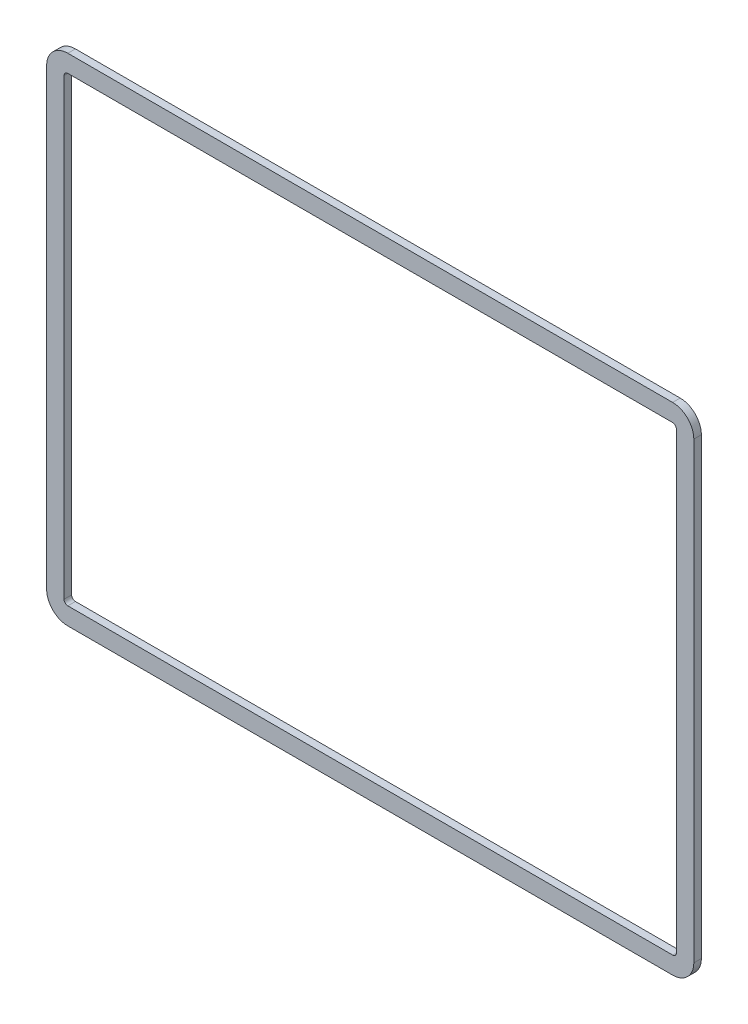
ISO-10303-21;
HEADER;
FILE_DESCRIPTION(('STEP AP214'),'2;1');
FILE_NAME('part.step','',(''),(''),'','','');
FILE_SCHEMA(('AUTOMOTIVE_DESIGN { 1 0 10303 214 1 1 1 1 }'));
ENDSEC;
DATA;
#1=APPLICATION_CONTEXT('core data for automotive mechanical design processes');
#2=APPLICATION_PROTOCOL_DEFINITION('international standard','automotive_design',2000,#1);
#3=PRODUCT_CONTEXT('',#1,'mechanical');
#4=PRODUCT('Part','Part','',(#3));
#5=PRODUCT_RELATED_PRODUCT_CATEGORY('part','',(#4));
#6=PRODUCT_DEFINITION_FORMATION('','',#4);
#7=PRODUCT_DEFINITION_CONTEXT('part definition',#1,'design');
#8=PRODUCT_DEFINITION('design','',#6,#7);
#9=PRODUCT_DEFINITION_SHAPE('','',#8);
#10=(LENGTH_UNIT() NAMED_UNIT(*) SI_UNIT(.MILLI.,.METRE.));
#11=(NAMED_UNIT(*) PLANE_ANGLE_UNIT() SI_UNIT($,.RADIAN.));
#12=(NAMED_UNIT(*) SI_UNIT($,.STERADIAN.) SOLID_ANGLE_UNIT());
#13=UNCERTAINTY_MEASURE_WITH_UNIT(LENGTH_MEASURE(1.E-05),#10,'distance_accuracy_value','');
#14=(GEOMETRIC_REPRESENTATION_CONTEXT(3) GLOBAL_UNCERTAINTY_ASSIGNED_CONTEXT((#13)) GLOBAL_UNIT_ASSIGNED_CONTEXT((#10,
#11,#12)) REPRESENTATION_CONTEXT('',''));
#15=CARTESIAN_POINT('',(0.,0.,0.));
#16=DIRECTION('',(0.,0.,1.));
#17=DIRECTION('',(1.,0.,0.));
#18=AXIS2_PLACEMENT_3D('',#15,#16,#17);
#19=CARTESIAN_POINT('',(0.,0.,0.));
#20=DIRECTION('',(0.,0.,-1.));
#21=DIRECTION('',(-1.,0.,0.));
#22=AXIS2_PLACEMENT_3D('',#19,#20,#21);
#23=PLANE('',#22);
#24=DIRECTION('',(-1.,0.,0.));
#25=VECTOR('',#24,1.);
#26=CARTESIAN_POINT('',(842.873702112464,-1312.94252894504,0.));
#27=LINE('',#26,#25);
#28=CARTESIAN_POINT('',(842.873702112464,-1312.94252894504,0.));
#29=VERTEX_POINT('',#28);
#30=CARTESIAN_POINT('',(639.673702112464,-1312.94252894504,0.));
#31=VERTEX_POINT('',#30);
#32=EDGE_CURVE('E227',#29,#31,#27,.T.);
#33=ORIENTED_EDGE('',*,*,#32,.T.);
#34=CARTESIAN_POINT('',(639.673702112464,-1320.06252894504,0.));
#35=DIRECTION('',(0.,0.,1.));
#36=DIRECTION('',(1.,0.,0.));
#37=AXIS2_PLACEMENT_3D('',#34,#35,#36);
#38=CIRCLE('',#37,7.12000000000007);
#39=CARTESIAN_POINT('',(632.553702112464,-1320.06252894504,0.));
#40=VERTEX_POINT('',#39);
#41=EDGE_CURVE('E11',#31,#40,#38,.T.);
#42=ORIENTED_EDGE('',*,*,#41,.T.);
#43=DIRECTION('',(0.,-1.,0.));
#44=VECTOR('',#43,1.);
#45=CARTESIAN_POINT('',(632.553702112464,-1320.06252894504,0.));
#46=LINE('',#45,#44);
#47=CARTESIAN_POINT('',(632.553702112464,-1472.46252894504,0.));
#48=VERTEX_POINT('',#47);
#49=EDGE_CURVE('E47',#40,#48,#46,.T.);
#50=ORIENTED_EDGE('',*,*,#49,.T.);
#51=CARTESIAN_POINT('',(639.673702112464,-1472.46252894504,0.));
#52=DIRECTION('',(0.,0.,1.));
#53=DIRECTION('',(1.,0.,0.));
#54=AXIS2_PLACEMENT_3D('',#51,#52,#53);
#55=CIRCLE('',#54,7.12000000000007);
#56=CARTESIAN_POINT('',(639.673702112464,-1479.58252894504,0.));
#57=VERTEX_POINT('',#56);
#58=EDGE_CURVE('E213',#48,#57,#55,.T.);
#59=ORIENTED_EDGE('',*,*,#58,.T.);
#60=DIRECTION('',(1.,0.,0.));
#61=VECTOR('',#60,1.);
#62=CARTESIAN_POINT('',(639.673702112464,-1479.58252894504,0.));
#63=LINE('',#62,#61);
#64=CARTESIAN_POINT('',(842.873702112464,-1479.58252894504,0.));
#65=VERTEX_POINT('',#64);
#66=EDGE_CURVE('E216',#57,#65,#63,.T.);
#67=ORIENTED_EDGE('',*,*,#66,.T.);
#68=CARTESIAN_POINT('',(842.873702112464,-1472.46252894504,0.));
#69=DIRECTION('',(0.,0.,1.));
#70=DIRECTION('',(1.,0.,0.));
#71=AXIS2_PLACEMENT_3D('',#68,#69,#70);
#72=CIRCLE('',#71,7.12000000000002);
#73=CARTESIAN_POINT('',(849.993702112464,-1472.46252894504,0.));
#74=VERTEX_POINT('',#73);
#75=EDGE_CURVE('E219',#65,#74,#72,.T.);
#76=ORIENTED_EDGE('',*,*,#75,.T.);
#77=DIRECTION('',(0.,1.,0.));
#78=VECTOR('',#77,1.);
#79=CARTESIAN_POINT('',(849.993702112464,-1472.46252894504,0.));
#80=LINE('',#79,#78);
#81=CARTESIAN_POINT('',(849.993702112464,-1320.06252894504,0.));
#82=VERTEX_POINT('',#81);
#83=EDGE_CURVE('E222',#74,#82,#80,.T.);
#84=ORIENTED_EDGE('',*,*,#83,.T.);
#85=CARTESIAN_POINT('',(842.873702112464,-1320.06252894504,0.));
#86=DIRECTION('',(0.,0.,1.));
#87=DIRECTION('',(1.,0.,0.));
#88=AXIS2_PLACEMENT_3D('',#85,#86,#87);
#89=CIRCLE('',#88,7.12000000000007);
#90=EDGE_CURVE('E225',#82,#29,#89,.T.);
#91=ORIENTED_EDGE('',*,*,#90,.T.);
#92=EDGE_LOOP('',(#33,#42,#50,#59,#67,#76,#84,#91));
#93=FACE_BOUND('',#92,.T.);
#94=CARTESIAN_POINT('',(842.873702112464,-1320.06252894504,0.));
#95=DIRECTION('',(0.,0.,-1.));
#96=DIRECTION('',(-1.,0.,0.));
#97=AXIS2_PLACEMENT_3D('',#94,#95,#96);
#98=CIRCLE('',#97,1.27000000000005);
#99=CARTESIAN_POINT('',(844.143702112464,-1320.06252894504,0.));
#100=VERTEX_POINT('',#99);
#101=CARTESIAN_POINT('',(842.873702112464,-1318.79252894504,0.));
#102=VERTEX_POINT('',#101);
#103=EDGE_CURVE('E42',#100,#102,#98,.F.);
#104=ORIENTED_EDGE('',*,*,#103,.F.);
#105=DIRECTION('',(0.,1.,0.));
#106=VECTOR('',#105,1.);
#107=CARTESIAN_POINT('',(844.143702112464,-1472.46252894504,0.));
#108=LINE('',#107,#106);
#109=CARTESIAN_POINT('',(844.143702112464,-1472.46252894504,0.));
#110=VERTEX_POINT('',#109);
#111=EDGE_CURVE('E170',#110,#100,#108,.T.);
#112=ORIENTED_EDGE('',*,*,#111,.F.);
#113=CARTESIAN_POINT('',(842.873702112464,-1472.46252894504,0.));
#114=DIRECTION('',(0.,0.,-1.));
#115=DIRECTION('',(-1.,0.,0.));
#116=AXIS2_PLACEMENT_3D('',#113,#114,#115);
#117=CIRCLE('',#116,1.26999999999999);
#118=CARTESIAN_POINT('',(842.873702112464,-1473.73252894504,0.));
#119=VERTEX_POINT('',#118);
#120=EDGE_CURVE('E229',#119,#110,#117,.F.);
#121=ORIENTED_EDGE('',*,*,#120,.F.);
#122=DIRECTION('',(1.,0.,0.));
#123=VECTOR('',#122,1.);
#124=CARTESIAN_POINT('',(639.673702112464,-1473.73252894504,0.));
#125=LINE('',#124,#123);
#126=CARTESIAN_POINT('',(639.673702112464,-1473.73252894504,0.));
#127=VERTEX_POINT('',#126);
#128=EDGE_CURVE('E262',#127,#119,#125,.T.);
#129=ORIENTED_EDGE('',*,*,#128,.F.);
#130=CARTESIAN_POINT('',(639.673702112464,-1472.46252894504,0.));
#131=DIRECTION('',(0.,0.,-1.));
#132=DIRECTION('',(-1.,0.,0.));
#133=AXIS2_PLACEMENT_3D('',#130,#131,#132);
#134=CIRCLE('',#133,1.27000000000005);
#135=CARTESIAN_POINT('',(638.403702112464,-1472.46252894504,0.));
#136=VERTEX_POINT('',#135);
#137=EDGE_CURVE('E251',#136,#127,#134,.F.);
#138=ORIENTED_EDGE('',*,*,#137,.F.);
#139=DIRECTION('',(0.,-1.,0.));
#140=VECTOR('',#139,1.);
#141=CARTESIAN_POINT('',(638.403702112464,-1320.06252894504,0.));
#142=LINE('',#141,#140);
#143=CARTESIAN_POINT('',(638.403702112464,-1320.06252894504,0.));
#144=VERTEX_POINT('',#143);
#145=EDGE_CURVE('E169',#144,#136,#142,.T.);
#146=ORIENTED_EDGE('',*,*,#145,.F.);
#147=CARTESIAN_POINT('',(639.673702112464,-1320.06252894504,0.));
#148=DIRECTION('',(0.,0.,-1.));
#149=DIRECTION('',(-1.,0.,0.));
#150=AXIS2_PLACEMENT_3D('',#147,#148,#149);
#151=CIRCLE('',#150,1.26999999999988);
#152=CARTESIAN_POINT('',(639.673702112464,-1318.79252894504,0.));
#153=VERTEX_POINT('',#152);
#154=EDGE_CURVE('E161',#153,#144,#151,.F.);
#155=ORIENTED_EDGE('',*,*,#154,.F.);
#156=DIRECTION('',(-1.,0.,0.));
#157=VECTOR('',#156,1.);
#158=CARTESIAN_POINT('',(842.873702112464,-1318.79252894504,0.));
#159=LINE('',#158,#157);
#160=EDGE_CURVE('E164',#102,#153,#159,.T.);
#161=ORIENTED_EDGE('',*,*,#160,.F.);
#162=EDGE_LOOP('',(#104,#112,#121,#129,#138,#146,#155,#161));
#163=FACE_BOUND('',#162,.T.);
#164=ADVANCED_FACE('F39',(#93,#163),#23,.F.);
#165=CARTESIAN_POINT('',(639.673702112464,-1320.06252894504,-2.54));
#166=DIRECTION('',(0.,0.,1.));
#167=DIRECTION('',(1.,0.,0.));
#168=AXIS2_PLACEMENT_3D('',#165,#166,#167);
#169=CYLINDRICAL_SURFACE('',#168,7.12000000000007);
#170=ORIENTED_EDGE('',*,*,#41,.F.);
#171=DIRECTION('',(0.,0.,1.));
#172=VECTOR('',#171,1.);
#173=CARTESIAN_POINT('',(639.673702112464,-1312.94252894504,-2.54));
#174=LINE('',#173,#172);
#175=CARTESIAN_POINT('',(639.673702112464,-1312.94252894504,-2.54));
#176=VERTEX_POINT('',#175);
#177=EDGE_CURVE('E162',#176,#31,#174,.T.);
#178=ORIENTED_EDGE('',*,*,#177,.F.);
#179=CARTESIAN_POINT('',(639.673702112464,-1320.06252894504,-2.54));
#180=DIRECTION('',(0.,0.,1.));
#181=DIRECTION('',(1.,0.,0.));
#182=AXIS2_PLACEMENT_3D('',#179,#180,#181);
#183=CIRCLE('',#182,7.12000000000007);
#184=CARTESIAN_POINT('',(632.553702112464,-1320.06252894504,-2.54));
#185=VERTEX_POINT('',#184);
#186=EDGE_CURVE('E186',#176,#185,#183,.T.);
#187=ORIENTED_EDGE('',*,*,#186,.T.);
#188=DIRECTION('',(0.,0.,1.));
#189=VECTOR('',#188,1.);
#190=CARTESIAN_POINT('',(632.553702112464,-1320.06252894504,-2.54));
#191=LINE('',#190,#189);
#192=EDGE_CURVE('E210',#185,#40,#191,.T.);
#193=ORIENTED_EDGE('',*,*,#192,.T.);
#194=EDGE_LOOP('',(#170,#178,#187,#193));
#195=FACE_BOUND('',#194,.T.);
#196=ADVANCED_FACE('F318',(#195),#169,.T.);
#197=CARTESIAN_POINT('',(632.553702112464,-1320.06252894504,-2.54));
#198=DIRECTION('',(-1.,0.,0.));
#199=DIRECTION('',(0.,0.,1.));
#200=AXIS2_PLACEMENT_3D('',#197,#198,#199);
#201=PLANE('',#200);
#202=ORIENTED_EDGE('',*,*,#49,.F.);
#203=ORIENTED_EDGE('',*,*,#192,.F.);
#204=DIRECTION('',(0.,-1.,0.));
#205=VECTOR('',#204,1.);
#206=CARTESIAN_POINT('',(632.553702112464,-1320.06252894504,-2.54));
#207=LINE('',#206,#205);
#208=CARTESIAN_POINT('',(632.553702112464,-1472.46252894504,-2.54));
#209=VERTEX_POINT('',#208);
#210=EDGE_CURVE('E189',#185,#209,#207,.T.);
#211=ORIENTED_EDGE('',*,*,#210,.T.);
#212=DIRECTION('',(0.,0.,1.));
#213=VECTOR('',#212,1.);
#214=CARTESIAN_POINT('',(632.553702112464,-1472.46252894504,-2.54));
#215=LINE('',#214,#213);
#216=EDGE_CURVE('E247',#209,#48,#215,.T.);
#217=ORIENTED_EDGE('',*,*,#216,.T.);
#218=EDGE_LOOP('',(#202,#203,#211,#217));
#219=FACE_BOUND('',#218,.T.);
#220=ADVANCED_FACE('F325',(#219),#201,.T.);
#221=CARTESIAN_POINT('',(639.673702112464,-1472.46252894504,-2.54));
#222=DIRECTION('',(0.,0.,1.));
#223=DIRECTION('',(1.,0.,0.));
#224=AXIS2_PLACEMENT_3D('',#221,#222,#223);
#225=CYLINDRICAL_SURFACE('',#224,7.12000000000007);
#226=ORIENTED_EDGE('',*,*,#58,.F.);
#227=ORIENTED_EDGE('',*,*,#216,.F.);
#228=CARTESIAN_POINT('',(639.673702112464,-1472.46252894504,-2.54));
#229=DIRECTION('',(0.,0.,1.));
#230=DIRECTION('',(1.,0.,0.));
#231=AXIS2_PLACEMENT_3D('',#228,#229,#230);
#232=CIRCLE('',#231,7.12000000000007);
#233=CARTESIAN_POINT('',(639.673702112464,-1479.58252894504,-2.54));
#234=VERTEX_POINT('',#233);
#235=EDGE_CURVE('E193',#209,#234,#232,.T.);
#236=ORIENTED_EDGE('',*,*,#235,.T.);
#237=DIRECTION('',(0.,0.,1.));
#238=VECTOR('',#237,1.);
#239=CARTESIAN_POINT('',(639.673702112464,-1479.58252894504,-2.54));
#240=LINE('',#239,#238);
#241=EDGE_CURVE('E244',#234,#57,#240,.T.);
#242=ORIENTED_EDGE('',*,*,#241,.T.);
#243=EDGE_LOOP('',(#226,#227,#236,#242));
#244=FACE_BOUND('',#243,.T.);
#245=ADVANCED_FACE('F346',(#244),#225,.T.);
#246=CARTESIAN_POINT('',(639.673702112464,-1479.58252894504,-2.54));
#247=DIRECTION('',(0.,-1.,0.));
#248=DIRECTION('',(0.,0.,-1.));
#249=AXIS2_PLACEMENT_3D('',#246,#247,#248);
#250=PLANE('',#249);
#251=ORIENTED_EDGE('',*,*,#66,.F.);
#252=ORIENTED_EDGE('',*,*,#241,.F.);
#253=DIRECTION('',(1.,0.,0.));
#254=VECTOR('',#253,1.);
#255=CARTESIAN_POINT('',(639.673702112464,-1479.58252894504,-2.54));
#256=LINE('',#255,#254);
#257=CARTESIAN_POINT('',(842.873702112464,-1479.58252894504,-2.54));
#258=VERTEX_POINT('',#257);
#259=EDGE_CURVE('E196',#234,#258,#256,.T.);
#260=ORIENTED_EDGE('',*,*,#259,.T.);
#261=DIRECTION('',(0.,0.,1.));
#262=VECTOR('',#261,1.);
#263=CARTESIAN_POINT('',(842.873702112464,-1479.58252894504,-2.54));
#264=LINE('',#263,#262);
#265=EDGE_CURVE('E241',#258,#65,#264,.T.);
#266=ORIENTED_EDGE('',*,*,#265,.T.);
#267=EDGE_LOOP('',(#251,#252,#260,#266));
#268=FACE_BOUND('',#267,.T.);
#269=ADVANCED_FACE('F342',(#268),#250,.T.);
#270=CARTESIAN_POINT('',(842.873702112464,-1472.46252894504,-2.54));
#271=DIRECTION('',(0.,0.,1.));
#272=DIRECTION('',(1.,0.,0.));
#273=AXIS2_PLACEMENT_3D('',#270,#271,#272);
#274=CYLINDRICAL_SURFACE('',#273,7.12000000000002);
#275=ORIENTED_EDGE('',*,*,#75,.F.);
#276=ORIENTED_EDGE('',*,*,#265,.F.);
#277=CARTESIAN_POINT('',(842.873702112464,-1472.46252894504,-2.54));
#278=DIRECTION('',(0.,0.,1.));
#279=DIRECTION('',(1.,0.,0.));
#280=AXIS2_PLACEMENT_3D('',#277,#278,#279);
#281=CIRCLE('',#280,7.12000000000002);
#282=CARTESIAN_POINT('',(849.993702112464,-1472.46252894504,-2.54));
#283=VERTEX_POINT('',#282);
#284=EDGE_CURVE('E199',#258,#283,#281,.T.);
#285=ORIENTED_EDGE('',*,*,#284,.T.);
#286=DIRECTION('',(0.,0.,1.));
#287=VECTOR('',#286,1.);
#288=CARTESIAN_POINT('',(849.993702112464,-1472.46252894504,-2.54));
#289=LINE('',#288,#287);
#290=EDGE_CURVE('E238',#283,#74,#289,.T.);
#291=ORIENTED_EDGE('',*,*,#290,.T.);
#292=EDGE_LOOP('',(#275,#276,#285,#291));
#293=FACE_BOUND('',#292,.T.);
#294=ADVANCED_FACE('F339',(#293),#274,.T.);
#295=CARTESIAN_POINT('',(842.873702112464,-1312.94252894504,-2.54));
#296=DIRECTION('',(0.,1.,0.));
#297=DIRECTION('',(0.,0.,1.));
#298=AXIS2_PLACEMENT_3D('',#295,#296,#297);
#299=PLANE('',#298);
#300=ORIENTED_EDGE('',*,*,#32,.F.);
#301=DIRECTION('',(0.,0.,1.));
#302=VECTOR('',#301,1.);
#303=CARTESIAN_POINT('',(842.873702112464,-1312.94252894504,-2.54));
#304=LINE('',#303,#302);
#305=CARTESIAN_POINT('',(842.873702112464,-1312.94252894504,-2.54));
#306=VERTEX_POINT('',#305);
#307=EDGE_CURVE('E232',#306,#29,#304,.T.);
#308=ORIENTED_EDGE('',*,*,#307,.F.);
#309=DIRECTION('',(-1.,0.,0.));
#310=VECTOR('',#309,1.);
#311=CARTESIAN_POINT('',(842.873702112464,-1312.94252894504,-2.54));
#312=LINE('',#311,#310);
#313=EDGE_CURVE('E208',#306,#176,#312,.T.);
#314=ORIENTED_EDGE('',*,*,#313,.T.);
#315=ORIENTED_EDGE('',*,*,#177,.T.);
#316=EDGE_LOOP('',(#300,#308,#314,#315));
#317=FACE_BOUND('',#316,.T.);
#318=ADVANCED_FACE('F336',(#317),#299,.T.);
#319=CARTESIAN_POINT('',(842.873702112464,-1472.46252894504,-2.54));
#320=DIRECTION('',(0.,0.,1.));
#321=DIRECTION('',(1.,0.,0.));
#322=AXIS2_PLACEMENT_3D('',#319,#320,#321);
#323=CYLINDRICAL_SURFACE('',#322,1.26999999999999);
#324=DIRECTION('',(0.,0.,1.));
#325=VECTOR('',#324,1.);
#326=CARTESIAN_POINT('',(842.873702112464,-1473.73252894504,-2.54));
#327=LINE('',#326,#325);
#328=CARTESIAN_POINT('',(842.873702112464,-1473.73252894504,-2.54));
#329=VERTEX_POINT('',#328);
#330=EDGE_CURVE('E190',#329,#119,#327,.T.);
#331=ORIENTED_EDGE('',*,*,#330,.T.);
#332=ORIENTED_EDGE('',*,*,#120,.T.);
#333=DIRECTION('',(0.,0.,1.));
#334=VECTOR('',#333,1.);
#335=CARTESIAN_POINT('',(844.143702112464,-1472.46252894504,-2.54));
#336=LINE('',#335,#334);
#337=CARTESIAN_POINT('',(844.143702112464,-1472.46252894504,-2.54));
#338=VERTEX_POINT('',#337);
#339=EDGE_CURVE('E179',#338,#110,#336,.T.);
#340=ORIENTED_EDGE('',*,*,#339,.F.);
#341=CARTESIAN_POINT('',(842.873702112464,-1472.46252894504,-2.54));
#342=DIRECTION('',(0.,0.,1.));
#343=DIRECTION('',(1.,0.,0.));
#344=AXIS2_PLACEMENT_3D('',#341,#342,#343);
#345=CIRCLE('',#344,1.26999999999999);
#346=EDGE_CURVE('E275',#329,#338,#345,.T.);
#347=ORIENTED_EDGE('',*,*,#346,.F.);
#348=EDGE_LOOP('',(#331,#332,#340,#347));
#349=FACE_BOUND('',#348,.T.);
#350=ADVANCED_FACE('F299',(#349),#323,.F.);
#351=CARTESIAN_POINT('',(639.673702112464,-1320.06252894504,-2.54));
#352=DIRECTION('',(0.,0.,1.));
#353=DIRECTION('',(1.,0.,0.));
#354=AXIS2_PLACEMENT_3D('',#351,#352,#353);
#355=PLANE('',#354);
#356=DIRECTION('',(1.,0.,0.));
#357=VECTOR('',#356,1.);
#358=CARTESIAN_POINT('',(639.673702112464,-1473.73252894504,-2.54));
#359=LINE('',#358,#357);
#360=CARTESIAN_POINT('',(639.673702112464,-1473.73252894504,-2.54));
#361=VERTEX_POINT('',#360);
#362=EDGE_CURVE('E185',#361,#329,#359,.T.);
#363=ORIENTED_EDGE('',*,*,#362,.T.);
#364=ORIENTED_EDGE('',*,*,#346,.T.);
#365=DIRECTION('',(0.,1.,0.));
#366=VECTOR('',#365,1.);
#367=CARTESIAN_POINT('',(844.143702112464,-1472.46252894504,-2.54));
#368=LINE('',#367,#366);
#369=CARTESIAN_POINT('',(844.143702112464,-1320.06252894504,-2.54));
#370=VERTEX_POINT('',#369);
#371=EDGE_CURVE('E288',#338,#370,#368,.T.);
#372=ORIENTED_EDGE('',*,*,#371,.T.);
#373=CARTESIAN_POINT('',(842.873702112464,-1320.06252894504,-2.54));
#374=DIRECTION('',(0.,0.,1.));
#375=DIRECTION('',(1.,0.,0.));
#376=AXIS2_PLACEMENT_3D('',#373,#374,#375);
#377=CIRCLE('',#376,1.27000000000005);
#378=CARTESIAN_POINT('',(842.873702112464,-1318.79252894504,-2.54));
#379=VERTEX_POINT('',#378);
#380=EDGE_CURVE('E286',#370,#379,#377,.T.);
#381=ORIENTED_EDGE('',*,*,#380,.T.);
#382=DIRECTION('',(-1.,0.,0.));
#383=VECTOR('',#382,1.);
#384=CARTESIAN_POINT('',(842.873702112464,-1318.79252894504,-2.54));
#385=LINE('',#384,#383);
#386=CARTESIAN_POINT('',(639.673702112464,-1318.79252894504,-2.54));
#387=VERTEX_POINT('',#386);
#388=EDGE_CURVE('E173',#379,#387,#385,.T.);
#389=ORIENTED_EDGE('',*,*,#388,.T.);
#390=CARTESIAN_POINT('',(639.673702112464,-1320.06252894504,-2.54));
#391=DIRECTION('',(0.,0.,1.));
#392=DIRECTION('',(1.,0.,0.));
#393=AXIS2_PLACEMENT_3D('',#390,#391,#392);
#394=CIRCLE('',#393,1.26999999999988);
#395=CARTESIAN_POINT('',(638.403702112464,-1320.06252894504,-2.54));
#396=VERTEX_POINT('',#395);
#397=EDGE_CURVE('E283',#387,#396,#394,.T.);
#398=ORIENTED_EDGE('',*,*,#397,.T.);
#399=DIRECTION('',(0.,-1.,0.));
#400=VECTOR('',#399,1.);
#401=CARTESIAN_POINT('',(638.403702112464,-1320.06252894504,-2.54));
#402=LINE('',#401,#400);
#403=CARTESIAN_POINT('',(638.403702112464,-1472.46252894504,-2.54));
#404=VERTEX_POINT('',#403);
#405=EDGE_CURVE('E265',#396,#404,#402,.T.);
#406=ORIENTED_EDGE('',*,*,#405,.T.);
#407=CARTESIAN_POINT('',(639.673702112464,-1472.46252894504,-2.54));
#408=DIRECTION('',(0.,0.,1.));
#409=DIRECTION('',(1.,0.,0.));
#410=AXIS2_PLACEMENT_3D('',#407,#408,#409);
#411=CIRCLE('',#410,1.27000000000005);
#412=EDGE_CURVE('E279',#404,#361,#411,.T.);
#413=ORIENTED_EDGE('',*,*,#412,.T.);
#414=EDGE_LOOP('',(#363,#364,#372,#381,#389,#398,#406,#413));
#415=FACE_BOUND('',#414,.T.);
#416=ORIENTED_EDGE('',*,*,#186,.F.);
#417=ORIENTED_EDGE('',*,*,#313,.F.);
#418=CARTESIAN_POINT('',(842.873702112464,-1320.06252894504,-2.54));
#419=DIRECTION('',(0.,0.,1.));
#420=DIRECTION('',(1.,0.,0.));
#421=AXIS2_PLACEMENT_3D('',#418,#419,#420);
#422=CIRCLE('',#421,7.12000000000007);
#423=CARTESIAN_POINT('',(849.993702112464,-1320.06252894504,-2.54));
#424=VERTEX_POINT('',#423);
#425=EDGE_CURVE('E205',#424,#306,#422,.T.);
#426=ORIENTED_EDGE('',*,*,#425,.F.);
#427=DIRECTION('',(0.,1.,0.));
#428=VECTOR('',#427,1.);
#429=CARTESIAN_POINT('',(849.993702112464,-1472.46252894504,-2.54));
#430=LINE('',#429,#428);
#431=EDGE_CURVE('E202',#283,#424,#430,.T.);
#432=ORIENTED_EDGE('',*,*,#431,.F.);
#433=ORIENTED_EDGE('',*,*,#284,.F.);
#434=ORIENTED_EDGE('',*,*,#259,.F.);
#435=ORIENTED_EDGE('',*,*,#235,.F.);
#436=ORIENTED_EDGE('',*,*,#210,.F.);
#437=EDGE_LOOP('',(#416,#417,#426,#432,#433,#434,#435,#436));
#438=FACE_BOUND('',#437,.T.);
#439=ADVANCED_FACE('F293',(#415,#438),#355,.F.);
#440=CARTESIAN_POINT('',(842.873702112464,-1320.06252894504,-2.54));
#441=DIRECTION('',(0.,0.,1.));
#442=DIRECTION('',(1.,0.,0.));
#443=AXIS2_PLACEMENT_3D('',#440,#441,#442);
#444=CYLINDRICAL_SURFACE('',#443,1.27000000000005);
#445=DIRECTION('',(0.,0.,1.));
#446=VECTOR('',#445,1.);
#447=CARTESIAN_POINT('',(844.143702112464,-1320.06252894504,-2.54));
#448=LINE('',#447,#446);
#449=EDGE_CURVE('E158',#370,#100,#448,.T.);
#450=ORIENTED_EDGE('',*,*,#449,.T.);
#451=ORIENTED_EDGE('',*,*,#103,.T.);
#452=DIRECTION('',(0.,0.,1.));
#453=VECTOR('',#452,1.);
#454=CARTESIAN_POINT('',(842.873702112464,-1318.79252894504,-2.54));
#455=LINE('',#454,#453);
#456=EDGE_CURVE('E155',#379,#102,#455,.T.);
#457=ORIENTED_EDGE('',*,*,#456,.F.);
#458=ORIENTED_EDGE('',*,*,#380,.F.);
#459=EDGE_LOOP('',(#450,#451,#457,#458));
#460=FACE_BOUND('',#459,.T.);
#461=ADVANCED_FACE('F152',(#460),#444,.F.);
#462=CARTESIAN_POINT('',(844.143702112464,-1472.46252894504,-2.54));
#463=DIRECTION('',(1.,0.,0.));
#464=DIRECTION('',(0.,1.,0.));
#465=AXIS2_PLACEMENT_3D('',#462,#463,#464);
#466=PLANE('',#465);
#467=ORIENTED_EDGE('',*,*,#449,.F.);
#468=ORIENTED_EDGE('',*,*,#371,.F.);
#469=ORIENTED_EDGE('',*,*,#339,.T.);
#470=ORIENTED_EDGE('',*,*,#111,.T.);
#471=EDGE_LOOP('',(#467,#468,#469,#470));
#472=FACE_BOUND('',#471,.T.);
#473=ADVANCED_FACE('F302',(#472),#466,.F.);
#474=CARTESIAN_POINT('',(639.673702112464,-1320.06252894504,-2.54));
#475=DIRECTION('',(0.,0.,1.));
#476=DIRECTION('',(1.,0.,0.));
#477=AXIS2_PLACEMENT_3D('',#474,#475,#476);
#478=CYLINDRICAL_SURFACE('',#477,1.26999999999988);
#479=DIRECTION('',(0.,0.,1.));
#480=VECTOR('',#479,1.);
#481=CARTESIAN_POINT('',(639.673702112464,-1318.79252894504,-2.54));
#482=LINE('',#481,#480);
#483=EDGE_CURVE('E175',#387,#153,#482,.T.);
#484=ORIENTED_EDGE('',*,*,#483,.T.);
#485=ORIENTED_EDGE('',*,*,#154,.T.);
#486=DIRECTION('',(0.,0.,1.));
#487=VECTOR('',#486,1.);
#488=CARTESIAN_POINT('',(638.403702112464,-1320.06252894504,-2.54));
#489=LINE('',#488,#487);
#490=EDGE_CURVE('E177',#396,#144,#489,.T.);
#491=ORIENTED_EDGE('',*,*,#490,.F.);
#492=ORIENTED_EDGE('',*,*,#397,.F.);
#493=EDGE_LOOP('',(#484,#485,#491,#492));
#494=FACE_BOUND('',#493,.T.);
#495=ADVANCED_FACE('F253',(#494),#478,.F.);
#496=CARTESIAN_POINT('',(842.873702112464,-1318.79252894504,-2.54));
#497=DIRECTION('',(0.,1.,0.));
#498=DIRECTION('',(-1.,0.,0.));
#499=AXIS2_PLACEMENT_3D('',#496,#497,#498);
#500=PLANE('',#499);
#501=ORIENTED_EDGE('',*,*,#483,.F.);
#502=ORIENTED_EDGE('',*,*,#388,.F.);
#503=ORIENTED_EDGE('',*,*,#456,.T.);
#504=ORIENTED_EDGE('',*,*,#160,.T.);
#505=EDGE_LOOP('',(#501,#502,#503,#504));
#506=FACE_BOUND('',#505,.T.);
#507=ADVANCED_FACE('F172',(#506),#500,.F.);
#508=CARTESIAN_POINT('',(639.673702112464,-1472.46252894504,-2.54));
#509=DIRECTION('',(0.,0.,1.));
#510=DIRECTION('',(1.,0.,0.));
#511=AXIS2_PLACEMENT_3D('',#508,#509,#510);
#512=CYLINDRICAL_SURFACE('',#511,1.27000000000005);
#513=DIRECTION('',(0.,0.,1.));
#514=VECTOR('',#513,1.);
#515=CARTESIAN_POINT('',(638.403702112464,-1472.46252894504,-2.54));
#516=LINE('',#515,#514);
#517=EDGE_CURVE('E267',#404,#136,#516,.T.);
#518=ORIENTED_EDGE('',*,*,#517,.T.);
#519=ORIENTED_EDGE('',*,*,#137,.T.);
#520=DIRECTION('',(0.,0.,1.));
#521=VECTOR('',#520,1.);
#522=CARTESIAN_POINT('',(639.673702112464,-1473.73252894504,-2.54));
#523=LINE('',#522,#521);
#524=EDGE_CURVE('E268',#361,#127,#523,.T.);
#525=ORIENTED_EDGE('',*,*,#524,.F.);
#526=ORIENTED_EDGE('',*,*,#412,.F.);
#527=EDGE_LOOP('',(#518,#519,#525,#526));
#528=FACE_BOUND('',#527,.T.);
#529=ADVANCED_FACE('F307',(#528),#512,.F.);
#530=CARTESIAN_POINT('',(638.403702112464,-1320.06252894504,-2.54));
#531=DIRECTION('',(-1.,0.,0.));
#532=DIRECTION('',(0.,-1.,0.));
#533=AXIS2_PLACEMENT_3D('',#530,#531,#532);
#534=PLANE('',#533);
#535=ORIENTED_EDGE('',*,*,#517,.F.);
#536=ORIENTED_EDGE('',*,*,#405,.F.);
#537=ORIENTED_EDGE('',*,*,#490,.T.);
#538=ORIENTED_EDGE('',*,*,#145,.T.);
#539=EDGE_LOOP('',(#535,#536,#537,#538));
#540=FACE_BOUND('',#539,.T.);
#541=ADVANCED_FACE('F264',(#540),#534,.F.);
#542=CARTESIAN_POINT('',(639.673702112464,-1473.73252894504,-2.54));
#543=DIRECTION('',(0.,-1.,0.));
#544=DIRECTION('',(0.,0.,-1.));
#545=AXIS2_PLACEMENT_3D('',#542,#543,#544);
#546=PLANE('',#545);
#547=ORIENTED_EDGE('',*,*,#330,.F.);
#548=ORIENTED_EDGE('',*,*,#362,.F.);
#549=ORIENTED_EDGE('',*,*,#524,.T.);
#550=ORIENTED_EDGE('',*,*,#128,.T.);
#551=EDGE_LOOP('',(#547,#548,#549,#550));
#552=FACE_BOUND('',#551,.T.);
#553=ADVANCED_FACE('F304',(#552),#546,.F.);
#554=CARTESIAN_POINT('',(849.993702112464,-1472.46252894504,-2.54));
#555=DIRECTION('',(1.,0.,0.));
#556=DIRECTION('',(0.,1.,0.));
#557=AXIS2_PLACEMENT_3D('',#554,#555,#556);
#558=PLANE('',#557);
#559=ORIENTED_EDGE('',*,*,#83,.F.);
#560=ORIENTED_EDGE('',*,*,#290,.F.);
#561=ORIENTED_EDGE('',*,*,#431,.T.);
#562=DIRECTION('',(0.,0.,1.));
#563=VECTOR('',#562,1.);
#564=CARTESIAN_POINT('',(849.993702112464,-1320.06252894504,-2.54));
#565=LINE('',#564,#563);
#566=EDGE_CURVE('E235',#424,#82,#565,.T.);
#567=ORIENTED_EDGE('',*,*,#566,.T.);
#568=EDGE_LOOP('',(#559,#560,#561,#567));
#569=FACE_BOUND('',#568,.T.);
#570=ADVANCED_FACE('F327',(#569),#558,.T.);
#571=CARTESIAN_POINT('',(842.873702112464,-1320.06252894504,-2.54));
#572=DIRECTION('',(0.,0.,1.));
#573=DIRECTION('',(1.,0.,0.));
#574=AXIS2_PLACEMENT_3D('',#571,#572,#573);
#575=CYLINDRICAL_SURFACE('',#574,7.12000000000007);
#576=ORIENTED_EDGE('',*,*,#90,.F.);
#577=ORIENTED_EDGE('',*,*,#566,.F.);
#578=ORIENTED_EDGE('',*,*,#425,.T.);
#579=ORIENTED_EDGE('',*,*,#307,.T.);
#580=EDGE_LOOP('',(#576,#577,#578,#579));
#581=FACE_BOUND('',#580,.T.);
#582=ADVANCED_FACE('F320',(#581),#575,.T.);
#583=CLOSED_SHELL('',(#164,#196,#220,#245,#269,#294,#318,#350,#439,#461,#473,#495,#507,#529,
#541,#553,#570,#582));
#584=MANIFOLD_SOLID_BREP('B2',#583);
#585=ADVANCED_BREP_SHAPE_REPRESENTATION('',(#18,#584),#14);
#586=SHAPE_DEFINITION_REPRESENTATION(#9,#585);
ENDSEC;
END-ISO-10303-21;
